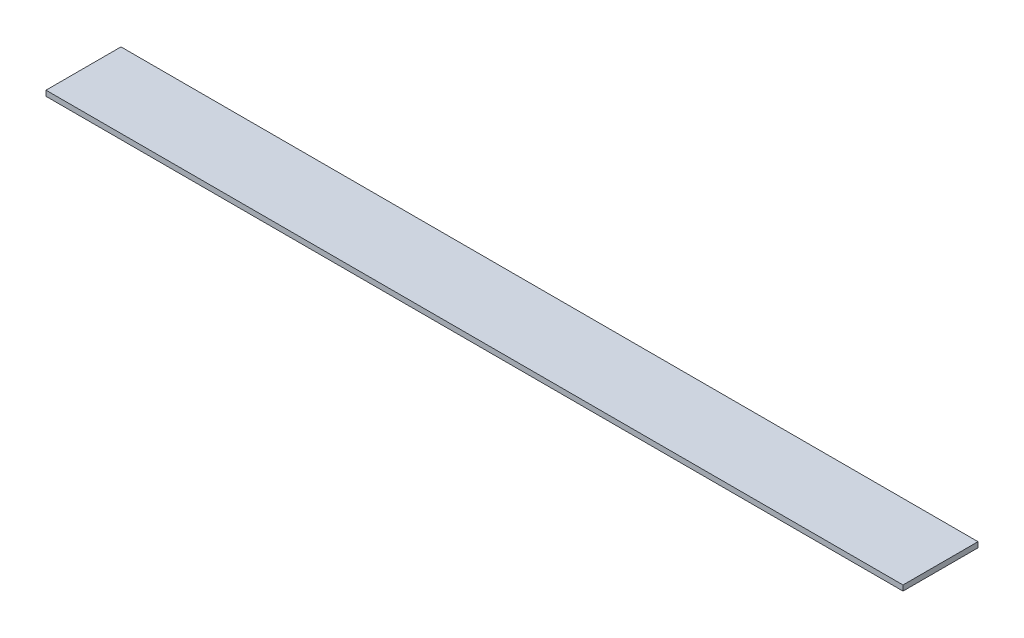
ISO-10303-21;
HEADER;
FILE_DESCRIPTION(('STEP AP214'),'2;1');
FILE_NAME('part.step','',(''),(''),'','','');
FILE_SCHEMA(('AUTOMOTIVE_DESIGN { 1 0 10303 214 1 1 1 1 }'));
ENDSEC;
DATA;
#1=APPLICATION_CONTEXT('core data for automotive mechanical design processes');
#2=APPLICATION_PROTOCOL_DEFINITION('international standard','automotive_design',2000,#1);
#3=PRODUCT_CONTEXT('',#1,'mechanical');
#4=PRODUCT('Part','Part','',(#3));
#5=PRODUCT_RELATED_PRODUCT_CATEGORY('part','',(#4));
#6=PRODUCT_DEFINITION_FORMATION('','',#4);
#7=PRODUCT_DEFINITION_CONTEXT('part definition',#1,'design');
#8=PRODUCT_DEFINITION('design','',#6,#7);
#9=PRODUCT_DEFINITION_SHAPE('','',#8);
#10=(LENGTH_UNIT() NAMED_UNIT(*) SI_UNIT(.MILLI.,.METRE.));
#11=(NAMED_UNIT(*) PLANE_ANGLE_UNIT() SI_UNIT($,.RADIAN.));
#12=(NAMED_UNIT(*) SI_UNIT($,.STERADIAN.) SOLID_ANGLE_UNIT());
#13=UNCERTAINTY_MEASURE_WITH_UNIT(LENGTH_MEASURE(1.E-05),#10,'distance_accuracy_value','');
#14=(GEOMETRIC_REPRESENTATION_CONTEXT(3) GLOBAL_UNCERTAINTY_ASSIGNED_CONTEXT((#13)) GLOBAL_UNIT_ASSIGNED_CONTEXT((#10,
#11,#12)) REPRESENTATION_CONTEXT('',''));
#15=CARTESIAN_POINT('',(0.,0.,0.));
#16=DIRECTION('',(0.,0.,1.));
#17=DIRECTION('',(1.,0.,0.));
#18=AXIS2_PLACEMENT_3D('',#15,#16,#17);
#19=CARTESIAN_POINT('',(0.799999999999999,0.01,-0.07));
#20=DIRECTION('',(-1.,0.,0.));
#21=DIRECTION('',(0.,0.,1.));
#22=AXIS2_PLACEMENT_3D('',#19,#20,#21);
#23=PLANE('',#22);
#24=DIRECTION('',(0.,0.,-1.));
#25=VECTOR('',#24,1.);
#26=CARTESIAN_POINT('',(0.799999999999999,0.,-0.07));
#27=LINE('',#26,#25);
#28=CARTESIAN_POINT('',(0.799999999999999,0.,0.07));
#29=VERTEX_POINT('',#28);
#30=CARTESIAN_POINT('',(0.799999999999999,0.,-0.07));
#31=VERTEX_POINT('',#30);
#32=EDGE_CURVE('E106',#29,#31,#27,.T.);
#33=ORIENTED_EDGE('',*,*,#32,.T.);
#34=DIRECTION('',(0.,-1.,0.));
#35=VECTOR('',#34,1.);
#36=CARTESIAN_POINT('',(0.799999999999999,0.01,-0.07));
#37=LINE('',#36,#35);
#38=CARTESIAN_POINT('',(0.799999999999999,0.01,-0.07));
#39=VERTEX_POINT('',#38);
#40=EDGE_CURVE('E11',#39,#31,#37,.T.);
#41=ORIENTED_EDGE('',*,*,#40,.F.);
#42=DIRECTION('',(0.,0.,-1.));
#43=VECTOR('',#42,1.);
#44=CARTESIAN_POINT('',(0.799999999999999,0.01,-0.07));
#45=LINE('',#44,#43);
#46=CARTESIAN_POINT('',(0.799999999999999,0.01,0.07));
#47=VERTEX_POINT('',#46);
#48=EDGE_CURVE('E90',#47,#39,#45,.T.);
#49=ORIENTED_EDGE('',*,*,#48,.F.);
#50=DIRECTION('',(0.,-1.,0.));
#51=VECTOR('',#50,1.);
#52=CARTESIAN_POINT('',(0.799999999999999,0.01,0.07));
#53=LINE('',#52,#51);
#54=EDGE_CURVE('E102',#47,#29,#53,.T.);
#55=ORIENTED_EDGE('',*,*,#54,.T.);
#56=EDGE_LOOP('',(#33,#41,#49,#55));
#57=FACE_BOUND('',#56,.T.);
#58=ADVANCED_FACE('F38',(#57),#23,.F.);
#59=CARTESIAN_POINT('',(-0.800000000000001,0.01,-0.07));
#60=DIRECTION('',(0.,0.,1.));
#61=DIRECTION('',(1.,0.,0.));
#62=AXIS2_PLACEMENT_3D('',#59,#60,#61);
#63=PLANE('',#62);
#64=DIRECTION('',(-1.,0.,0.));
#65=VECTOR('',#64,1.);
#66=CARTESIAN_POINT('',(-0.800000000000001,0.,-0.07));
#67=LINE('',#66,#65);
#68=CARTESIAN_POINT('',(-0.800000000000001,0.,-0.07));
#69=VERTEX_POINT('',#68);
#70=EDGE_CURVE('E95',#31,#69,#67,.T.);
#71=ORIENTED_EDGE('',*,*,#70,.T.);
#72=DIRECTION('',(0.,-1.,0.));
#73=VECTOR('',#72,1.);
#74=CARTESIAN_POINT('',(-0.800000000000001,0.01,-0.07));
#75=LINE('',#74,#73);
#76=CARTESIAN_POINT('',(-0.800000000000001,0.01,-0.07));
#77=VERTEX_POINT('',#76);
#78=EDGE_CURVE('E47',#77,#69,#75,.T.);
#79=ORIENTED_EDGE('',*,*,#78,.F.);
#80=DIRECTION('',(-1.,0.,0.));
#81=VECTOR('',#80,1.);
#82=CARTESIAN_POINT('',(-0.800000000000001,0.01,-0.07));
#83=LINE('',#82,#81);
#84=EDGE_CURVE('E85',#39,#77,#83,.T.);
#85=ORIENTED_EDGE('',*,*,#84,.F.);
#86=ORIENTED_EDGE('',*,*,#40,.T.);
#87=EDGE_LOOP('',(#71,#79,#85,#86));
#88=FACE_BOUND('',#87,.T.);
#89=ADVANCED_FACE('F94',(#88),#63,.F.);
#90=CARTESIAN_POINT('',(-0.800000000000001,0.01,-0.07));
#91=DIRECTION('',(1.,0.,0.));
#92=DIRECTION('',(0.,0.,-1.));
#93=AXIS2_PLACEMENT_3D('',#90,#91,#92);
#94=PLANE('',#93);
#95=DIRECTION('',(0.,0.,1.));
#96=VECTOR('',#95,1.);
#97=CARTESIAN_POINT('',(-0.800000000000001,0.,-0.07));
#98=LINE('',#97,#96);
#99=CARTESIAN_POINT('',(-0.800000000000001,0.,0.07));
#100=VERTEX_POINT('',#99);
#101=EDGE_CURVE('E72',#69,#100,#98,.T.);
#102=ORIENTED_EDGE('',*,*,#101,.T.);
#103=DIRECTION('',(0.,-1.,0.));
#104=VECTOR('',#103,1.);
#105=CARTESIAN_POINT('',(-0.800000000000001,0.01,0.07));
#106=LINE('',#105,#104);
#107=CARTESIAN_POINT('',(-0.800000000000001,0.01,0.07));
#108=VERTEX_POINT('',#107);
#109=EDGE_CURVE('E97',#108,#100,#106,.T.);
#110=ORIENTED_EDGE('',*,*,#109,.F.);
#111=DIRECTION('',(0.,0.,1.));
#112=VECTOR('',#111,1.);
#113=CARTESIAN_POINT('',(-0.800000000000001,0.01,-0.07));
#114=LINE('',#113,#112);
#115=EDGE_CURVE('E88',#77,#108,#114,.T.);
#116=ORIENTED_EDGE('',*,*,#115,.F.);
#117=ORIENTED_EDGE('',*,*,#78,.T.);
#118=EDGE_LOOP('',(#102,#110,#116,#117));
#119=FACE_BOUND('',#118,.T.);
#120=ADVANCED_FACE('F98',(#119),#94,.F.);
#121=CARTESIAN_POINT('',(-0.800000000000001,0.01,0.07));
#122=DIRECTION('',(0.,0.,-1.));
#123=DIRECTION('',(-1.,0.,0.));
#124=AXIS2_PLACEMENT_3D('',#121,#122,#123);
#125=PLANE('',#124);
#126=DIRECTION('',(1.,0.,0.));
#127=VECTOR('',#126,1.);
#128=CARTESIAN_POINT('',(-0.800000000000001,0.,0.07));
#129=LINE('',#128,#127);
#130=EDGE_CURVE('E78',#100,#29,#129,.T.);
#131=ORIENTED_EDGE('',*,*,#130,.T.);
#132=ORIENTED_EDGE('',*,*,#54,.F.);
#133=DIRECTION('',(1.,0.,0.));
#134=VECTOR('',#133,1.);
#135=CARTESIAN_POINT('',(-0.800000000000001,0.01,0.07));
#136=LINE('',#135,#134);
#137=EDGE_CURVE('E55',#108,#47,#136,.T.);
#138=ORIENTED_EDGE('',*,*,#137,.F.);
#139=ORIENTED_EDGE('',*,*,#109,.T.);
#140=EDGE_LOOP('',(#131,#132,#138,#139));
#141=FACE_BOUND('',#140,.T.);
#142=ADVANCED_FACE('F119',(#141),#125,.F.);
#143=CARTESIAN_POINT('',(0.,0.01,0.));
#144=DIRECTION('',(0.,1.,0.));
#145=DIRECTION('',(0.,0.,1.));
#146=AXIS2_PLACEMENT_3D('',#143,#144,#145);
#147=PLANE('',#146);
#148=ORIENTED_EDGE('',*,*,#48,.T.);
#149=ORIENTED_EDGE('',*,*,#84,.T.);
#150=ORIENTED_EDGE('',*,*,#115,.T.);
#151=ORIENTED_EDGE('',*,*,#137,.T.);
#152=EDGE_LOOP('',(#148,#149,#150,#151));
#153=FACE_BOUND('',#152,.T.);
#154=ADVANCED_FACE('F86',(#153),#147,.T.);
#155=CARTESIAN_POINT('',(0.,0.,0.));
#156=DIRECTION('',(0.,1.,0.));
#157=DIRECTION('',(0.,0.,1.));
#158=AXIS2_PLACEMENT_3D('',#155,#156,#157);
#159=PLANE('',#158);
#160=ORIENTED_EDGE('',*,*,#32,.F.);
#161=ORIENTED_EDGE('',*,*,#130,.F.);
#162=ORIENTED_EDGE('',*,*,#101,.F.);
#163=ORIENTED_EDGE('',*,*,#70,.F.);
#164=EDGE_LOOP('',(#160,#161,#162,#163));
#165=FACE_BOUND('',#164,.T.);
#166=ADVANCED_FACE('F122',(#165),#159,.F.);
#167=CLOSED_SHELL('',(#58,#89,#120,#142,#154,#166));
#168=MANIFOLD_SOLID_BREP('B2',#167);
#169=ADVANCED_BREP_SHAPE_REPRESENTATION('',(#18,#168),#14);
#170=SHAPE_DEFINITION_REPRESENTATION(#9,#169);
ENDSEC;
END-ISO-10303-21;
